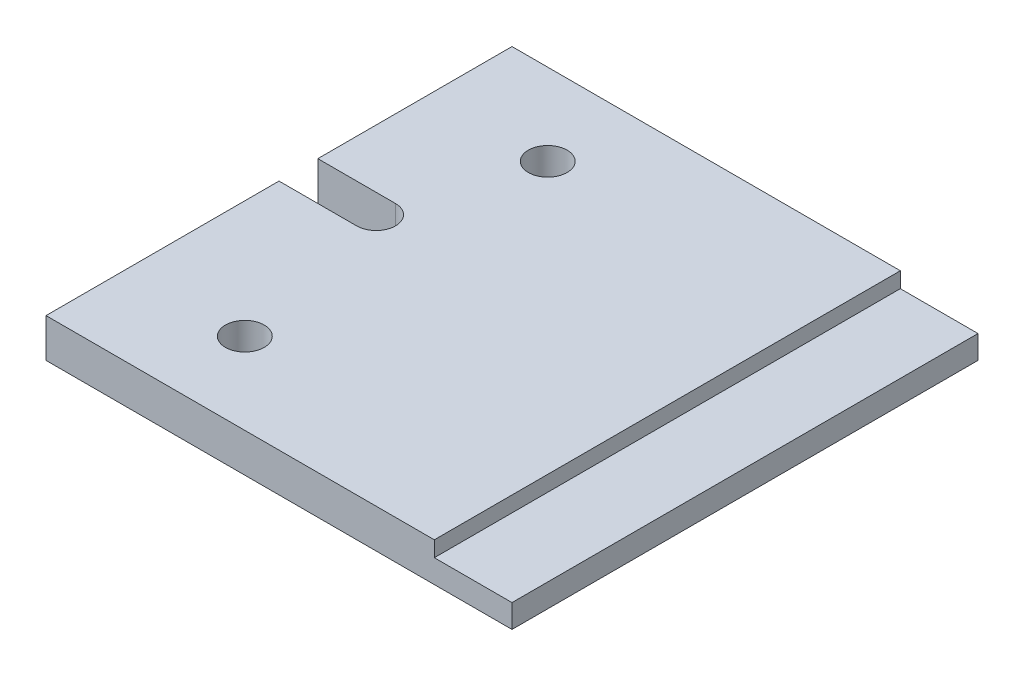
ISO-10303-21;
HEADER;
FILE_DESCRIPTION(('STEP AP214'),'2;1');
FILE_NAME('part.step','',(''),(''),'','','');
FILE_SCHEMA(('AUTOMOTIVE_DESIGN { 1 0 10303 214 1 1 1 1 }'));
ENDSEC;
DATA;
#1=APPLICATION_CONTEXT('core data for automotive mechanical design processes');
#2=APPLICATION_PROTOCOL_DEFINITION('international standard','automotive_design',2000,#1);
#3=PRODUCT_CONTEXT('',#1,'mechanical');
#4=PRODUCT('Part','Part','',(#3));
#5=PRODUCT_RELATED_PRODUCT_CATEGORY('part','',(#4));
#6=PRODUCT_DEFINITION_FORMATION('','',#4);
#7=PRODUCT_DEFINITION_CONTEXT('part definition',#1,'design');
#8=PRODUCT_DEFINITION('design','',#6,#7);
#9=PRODUCT_DEFINITION_SHAPE('','',#8);
#10=(LENGTH_UNIT() NAMED_UNIT(*) SI_UNIT(.MILLI.,.METRE.));
#11=(NAMED_UNIT(*) PLANE_ANGLE_UNIT() SI_UNIT($,.RADIAN.));
#12=(NAMED_UNIT(*) SI_UNIT($,.STERADIAN.) SOLID_ANGLE_UNIT());
#13=UNCERTAINTY_MEASURE_WITH_UNIT(LENGTH_MEASURE(1.E-05),#10,'distance_accuracy_value','');
#14=(GEOMETRIC_REPRESENTATION_CONTEXT(3) GLOBAL_UNCERTAINTY_ASSIGNED_CONTEXT((#13)) GLOBAL_UNIT_ASSIGNED_CONTEXT((#10,
#11,#12)) REPRESENTATION_CONTEXT('',''));
#15=CARTESIAN_POINT('',(0.,0.,0.));
#16=DIRECTION('',(0.,0.,1.));
#17=DIRECTION('',(1.,0.,0.));
#18=AXIS2_PLACEMENT_3D('',#15,#16,#17);
#19=CARTESIAN_POINT('',(0.,6.35,0.));
#20=DIRECTION('',(-1.,0.,0.));
#21=DIRECTION('',(0.,0.,1.));
#22=AXIS2_PLACEMENT_3D('',#19,#20,#21);
#23=PLANE('',#22);
#24=DIRECTION('',(0.,1.,0.));
#25=VECTOR('',#24,1.);
#26=CARTESIAN_POINT('',(0.,0.,-44.45));
#27=LINE('',#26,#25);
#28=CARTESIAN_POINT('',(0.,0.,-44.45));
#29=VERTEX_POINT('',#28);
#30=CARTESIAN_POINT('',(0.,6.35,-44.45));
#31=VERTEX_POINT('',#30);
#32=EDGE_CURVE('E204',#29,#31,#27,.T.);
#33=ORIENTED_EDGE('',*,*,#32,.T.);
#34=DIRECTION('',(0.,0.,-1.));
#35=VECTOR('',#34,1.);
#36=CARTESIAN_POINT('',(0.,6.35,0.));
#37=LINE('',#36,#35);
#38=CARTESIAN_POINT('',(0.,6.35,-76.2));
#39=VERTEX_POINT('',#38);
#40=EDGE_CURVE('E168',#31,#39,#37,.T.);
#41=ORIENTED_EDGE('',*,*,#40,.T.);
#42=DIRECTION('',(0.,-1.,0.));
#43=VECTOR('',#42,1.);
#44=CARTESIAN_POINT('',(0.,6.35,-76.2));
#45=LINE('',#44,#43);
#46=CARTESIAN_POINT('',(0.,0.,-76.2));
#47=VERTEX_POINT('',#46);
#48=EDGE_CURVE('E169',#39,#47,#45,.T.);
#49=ORIENTED_EDGE('',*,*,#48,.T.);
#50=DIRECTION('',(0.,0.,-1.));
#51=VECTOR('',#50,1.);
#52=CARTESIAN_POINT('',(0.,0.,0.));
#53=LINE('',#52,#51);
#54=EDGE_CURVE('E151',#29,#47,#53,.T.);
#55=ORIENTED_EDGE('',*,*,#54,.F.);
#56=EDGE_LOOP('',(#33,#41,#49,#55));
#57=FACE_BOUND('',#56,.T.);
#58=ADVANCED_FACE('F50',(#57),#23,.T.);
#59=CARTESIAN_POINT('',(76.2,6.35,0.));
#60=DIRECTION('',(-1.,0.,0.));
#61=DIRECTION('',(0.,0.,1.));
#62=AXIS2_PLACEMENT_3D('',#59,#60,#61);
#63=PLANE('',#62);
#64=DIRECTION('',(0.,0.,-1.));
#65=VECTOR('',#64,1.);
#66=CARTESIAN_POINT('',(76.2,3.81,0.));
#67=LINE('',#66,#65);
#68=CARTESIAN_POINT('',(76.2,3.81,0.));
#69=VERTEX_POINT('',#68);
#70=CARTESIAN_POINT('',(76.2,3.81,-76.2));
#71=VERTEX_POINT('',#70);
#72=EDGE_CURVE('E178',#69,#71,#67,.T.);
#73=ORIENTED_EDGE('',*,*,#72,.F.);
#74=DIRECTION('',(0.,-1.,0.));
#75=VECTOR('',#74,1.);
#76=CARTESIAN_POINT('',(76.2,6.35,0.));
#77=LINE('',#76,#75);
#78=CARTESIAN_POINT('',(76.2,0.,0.));
#79=VERTEX_POINT('',#78);
#80=EDGE_CURVE('E58',#69,#79,#77,.T.);
#81=ORIENTED_EDGE('',*,*,#80,.T.);
#82=DIRECTION('',(0.,0.,-1.));
#83=VECTOR('',#82,1.);
#84=CARTESIAN_POINT('',(76.2,0.,0.));
#85=LINE('',#84,#83);
#86=CARTESIAN_POINT('',(76.2,0.,-76.2));
#87=VERTEX_POINT('',#86);
#88=EDGE_CURVE('E153',#79,#87,#85,.T.);
#89=ORIENTED_EDGE('',*,*,#88,.T.);
#90=DIRECTION('',(0.,-1.,0.));
#91=VECTOR('',#90,1.);
#92=CARTESIAN_POINT('',(76.2,6.35,-76.2));
#93=LINE('',#92,#91);
#94=EDGE_CURVE('E172',#71,#87,#93,.T.);
#95=ORIENTED_EDGE('',*,*,#94,.F.);
#96=EDGE_LOOP('',(#73,#81,#89,#95));
#97=FACE_BOUND('',#96,.T.);
#98=ADVANCED_FACE('F176',(#97),#63,.F.);
#99=DIRECTION('',(0.,1.,0.));
#100=VECTOR('',#99,1.);
#101=CARTESIAN_POINT('',(0.,0.,-38.1));
#102=LINE('',#101,#100);
#103=CARTESIAN_POINT('',(0.,0.,-38.1));
#104=VERTEX_POINT('',#103);
#105=CARTESIAN_POINT('',(0.,6.35,-38.1));
#106=VERTEX_POINT('',#105);
#107=EDGE_CURVE('E130',#104,#106,#102,.T.);
#108=ORIENTED_EDGE('',*,*,#107,.F.);
#109=CARTESIAN_POINT('',(0.,0.,0.));
#110=VERTEX_POINT('',#109);
#111=EDGE_CURVE('E140',#110,#104,#53,.T.);
#112=ORIENTED_EDGE('',*,*,#111,.F.);
#113=DIRECTION('',(0.,-1.,0.));
#114=VECTOR('',#113,1.);
#115=CARTESIAN_POINT('',(0.,6.35,0.));
#116=LINE('',#115,#114);
#117=CARTESIAN_POINT('',(0.,6.35,0.));
#118=VERTEX_POINT('',#117);
#119=EDGE_CURVE('E12',#118,#110,#116,.T.);
#120=ORIENTED_EDGE('',*,*,#119,.F.);
#121=EDGE_CURVE('E142',#118,#106,#37,.T.);
#122=ORIENTED_EDGE('',*,*,#121,.T.);
#123=EDGE_LOOP('',(#108,#112,#120,#122));
#124=FACE_BOUND('',#123,.T.);
#125=ADVANCED_FACE('F52',(#124),#23,.T.);
#126=CARTESIAN_POINT('',(0.,6.35,0.));
#127=DIRECTION('',(0.,0.,-1.));
#128=DIRECTION('',(-1.,0.,0.));
#129=AXIS2_PLACEMENT_3D('',#126,#127,#128);
#130=PLANE('',#129);
#131=DIRECTION('',(1.,0.,0.));
#132=VECTOR('',#131,1.);
#133=CARTESIAN_POINT('',(63.5,3.81,0.));
#134=LINE('',#133,#132);
#135=CARTESIAN_POINT('',(63.5,3.81,0.));
#136=VERTEX_POINT('',#135);
#137=EDGE_CURVE('E198',#136,#69,#134,.T.);
#138=ORIENTED_EDGE('',*,*,#137,.F.);
#139=DIRECTION('',(0.,1.,0.));
#140=VECTOR('',#139,1.);
#141=CARTESIAN_POINT('',(63.5,3.81,0.));
#142=LINE('',#141,#140);
#143=CARTESIAN_POINT('',(63.5,6.35,0.));
#144=VERTEX_POINT('',#143);
#145=EDGE_CURVE('E205',#136,#144,#142,.T.);
#146=ORIENTED_EDGE('',*,*,#145,.T.);
#147=DIRECTION('',(1.,0.,0.));
#148=VECTOR('',#147,1.);
#149=CARTESIAN_POINT('',(0.,6.35,0.));
#150=LINE('',#149,#148);
#151=EDGE_CURVE('E215',#118,#144,#150,.T.);
#152=ORIENTED_EDGE('',*,*,#151,.F.);
#153=ORIENTED_EDGE('',*,*,#119,.T.);
#154=DIRECTION('',(1.,0.,0.));
#155=VECTOR('',#154,1.);
#156=CARTESIAN_POINT('',(0.,0.,0.));
#157=LINE('',#156,#155);
#158=EDGE_CURVE('E150',#110,#79,#157,.T.);
#159=ORIENTED_EDGE('',*,*,#158,.T.);
#160=ORIENTED_EDGE('',*,*,#80,.F.);
#161=EDGE_LOOP('',(#138,#146,#152,#153,#159,#160));
#162=FACE_BOUND('',#161,.T.);
#163=ADVANCED_FACE('F181',(#162),#130,.F.);
#164=CARTESIAN_POINT('',(0.,6.35,-76.2));
#165=DIRECTION('',(0.,0.,-1.));
#166=DIRECTION('',(-1.,0.,0.));
#167=AXIS2_PLACEMENT_3D('',#164,#165,#166);
#168=PLANE('',#167);
#169=DIRECTION('',(0.,1.,0.));
#170=VECTOR('',#169,1.);
#171=CARTESIAN_POINT('',(63.5,3.81,-76.2));
#172=LINE('',#171,#170);
#173=CARTESIAN_POINT('',(63.5,3.81,-76.2));
#174=VERTEX_POINT('',#173);
#175=CARTESIAN_POINT('',(63.5,6.35,-76.2));
#176=VERTEX_POINT('',#175);
#177=EDGE_CURVE('E73',#174,#176,#172,.T.);
#178=ORIENTED_EDGE('',*,*,#177,.F.);
#179=DIRECTION('',(-1.,0.,0.));
#180=VECTOR('',#179,1.);
#181=CARTESIAN_POINT('',(63.5,3.81,-76.2));
#182=LINE('',#181,#180);
#183=EDGE_CURVE('E192',#71,#174,#182,.T.);
#184=ORIENTED_EDGE('',*,*,#183,.F.);
#185=ORIENTED_EDGE('',*,*,#94,.T.);
#186=DIRECTION('',(1.,0.,0.));
#187=VECTOR('',#186,1.);
#188=CARTESIAN_POINT('',(0.,0.,-76.2));
#189=LINE('',#188,#187);
#190=EDGE_CURVE('E162',#47,#87,#189,.T.);
#191=ORIENTED_EDGE('',*,*,#190,.F.);
#192=ORIENTED_EDGE('',*,*,#48,.F.);
#193=DIRECTION('',(1.,0.,0.));
#194=VECTOR('',#193,1.);
#195=CARTESIAN_POINT('',(0.,6.35,-76.2));
#196=LINE('',#195,#194);
#197=EDGE_CURVE('E217',#39,#176,#196,.T.);
#198=ORIENTED_EDGE('',*,*,#197,.T.);
#199=EDGE_LOOP('',(#178,#184,#185,#191,#192,#198));
#200=FACE_BOUND('',#199,.T.);
#201=ADVANCED_FACE('F188',(#200),#168,.T.);
#202=CARTESIAN_POINT('',(19.177,6.35,-13.335));
#203=DIRECTION('',(0.,-1.,0.));
#204=DIRECTION('',(0.,0.,-1.));
#205=AXIS2_PLACEMENT_3D('',#202,#203,#204);
#206=CYLINDRICAL_SURFACE('',#205,3.175);
#207=CARTESIAN_POINT('',(19.177,6.35,-13.335));
#208=DIRECTION('',(0.,1.,0.));
#209=DIRECTION('',(0.,0.,1.));
#210=AXIS2_PLACEMENT_3D('',#207,#208,#209);
#211=CIRCLE('',#210,3.175);
#212=CARTESIAN_POINT('',(19.177,6.35,-10.16));
#213=VERTEX_POINT('',#212);
#214=EDGE_CURVE('E157',#213,#213,#211,.T.);
#215=ORIENTED_EDGE('',*,*,#214,.T.);
#216=EDGE_LOOP('',(#215));
#217=FACE_BOUND('',#216,.T.);
#218=CARTESIAN_POINT('',(19.177,0.,-13.335));
#219=DIRECTION('',(0.,1.,0.));
#220=DIRECTION('',(0.,0.,1.));
#221=AXIS2_PLACEMENT_3D('',#218,#219,#220);
#222=CIRCLE('',#221,3.175);
#223=CARTESIAN_POINT('',(19.177,0.,-10.16));
#224=VERTEX_POINT('',#223);
#225=EDGE_CURVE('E165',#224,#224,#222,.T.);
#226=ORIENTED_EDGE('',*,*,#225,.F.);
#227=EDGE_LOOP('',(#226));
#228=FACE_BOUND('',#227,.T.);
#229=ADVANCED_FACE('F221',(#217,#228),#206,.F.);
#230=CARTESIAN_POINT('',(0.,6.35,0.));
#231=DIRECTION('',(0.,1.,0.));
#232=DIRECTION('',(0.,0.,1.));
#233=AXIS2_PLACEMENT_3D('',#230,#231,#232);
#234=PLANE('',#233);
#235=DIRECTION('',(-1.,0.,0.));
#236=VECTOR('',#235,1.);
#237=CARTESIAN_POINT('',(0.,6.35,-44.45));
#238=LINE('',#237,#236);
#239=CARTESIAN_POINT('',(12.7,6.35,-44.45));
#240=VERTEX_POINT('',#239);
#241=EDGE_CURVE('E135',#240,#31,#238,.T.);
#242=ORIENTED_EDGE('',*,*,#241,.F.);
#243=CARTESIAN_POINT('',(12.7,6.35,-41.275));
#244=DIRECTION('',(0.,1.,0.));
#245=DIRECTION('',(0.,0.,-1.));
#246=AXIS2_PLACEMENT_3D('',#243,#244,#245);
#247=CIRCLE('',#246,3.175);
#248=CARTESIAN_POINT('',(12.7,6.35,-38.1));
#249=VERTEX_POINT('',#248);
#250=EDGE_CURVE('E351',#249,#240,#247,.T.);
#251=ORIENTED_EDGE('',*,*,#250,.F.);
#252=DIRECTION('',(1.,0.,0.));
#253=VECTOR('',#252,1.);
#254=CARTESIAN_POINT('',(0.,6.35,-38.1));
#255=LINE('',#254,#253);
#256=EDGE_CURVE('E349',#106,#249,#255,.T.);
#257=ORIENTED_EDGE('',*,*,#256,.F.);
#258=ORIENTED_EDGE('',*,*,#121,.F.);
#259=ORIENTED_EDGE('',*,*,#151,.T.);
#260=DIRECTION('',(0.,0.,1.));
#261=VECTOR('',#260,1.);
#262=CARTESIAN_POINT('',(63.5,6.35,0.));
#263=LINE('',#262,#261);
#264=EDGE_CURVE('E202',#176,#144,#263,.T.);
#265=ORIENTED_EDGE('',*,*,#264,.F.);
#266=ORIENTED_EDGE('',*,*,#197,.F.);
#267=ORIENTED_EDGE('',*,*,#40,.F.);
#268=EDGE_LOOP('',(#242,#251,#257,#258,#259,#265,#266,#267));
#269=FACE_BOUND('',#268,.T.);
#270=CARTESIAN_POINT('',(19.177,6.35,-62.865));
#271=DIRECTION('',(0.,-1.,0.));
#272=DIRECTION('',(0.,0.,-1.));
#273=AXIS2_PLACEMENT_3D('',#270,#271,#272);
#274=CIRCLE('',#273,3.175);
#275=CARTESIAN_POINT('',(19.177,6.35,-66.04));
#276=VERTEX_POINT('',#275);
#277=EDGE_CURVE('E155',#276,#276,#274,.T.);
#278=ORIENTED_EDGE('',*,*,#277,.T.);
#279=EDGE_LOOP('',(#278));
#280=FACE_BOUND('',#279,.T.);
#281=ORIENTED_EDGE('',*,*,#214,.F.);
#282=EDGE_LOOP('',(#281));
#283=FACE_BOUND('',#282,.T.);
#284=ADVANCED_FACE('F224',(#269,#280,#283),#234,.T.);
#285=CARTESIAN_POINT('',(0.,0.,0.));
#286=DIRECTION('',(0.,1.,0.));
#287=DIRECTION('',(0.,0.,1.));
#288=AXIS2_PLACEMENT_3D('',#285,#286,#287);
#289=PLANE('',#288);
#290=CARTESIAN_POINT('',(19.177,0.,-62.865));
#291=DIRECTION('',(0.,-1.,0.));
#292=DIRECTION('',(0.,0.,-1.));
#293=AXIS2_PLACEMENT_3D('',#290,#291,#292);
#294=CIRCLE('',#293,3.175);
#295=CARTESIAN_POINT('',(19.177,0.,-66.04));
#296=VERTEX_POINT('',#295);
#297=EDGE_CURVE('E208',#296,#296,#294,.T.);
#298=ORIENTED_EDGE('',*,*,#297,.F.);
#299=EDGE_LOOP('',(#298));
#300=FACE_BOUND('',#299,.T.);
#301=CARTESIAN_POINT('',(12.7,0.,-41.275));
#302=DIRECTION('',(0.,1.,0.));
#303=DIRECTION('',(0.,0.,-1.));
#304=AXIS2_PLACEMENT_3D('',#301,#302,#303);
#305=CIRCLE('',#304,3.175);
#306=CARTESIAN_POINT('',(12.7,0.,-38.1));
#307=VERTEX_POINT('',#306);
#308=CARTESIAN_POINT('',(12.7,0.,-44.45));
#309=VERTEX_POINT('',#308);
#310=EDGE_CURVE('E65',#307,#309,#305,.T.);
#311=ORIENTED_EDGE('',*,*,#310,.T.);
#312=DIRECTION('',(-1.,0.,0.));
#313=VECTOR('',#312,1.);
#314=CARTESIAN_POINT('',(0.,0.,-44.45));
#315=LINE('',#314,#313);
#316=EDGE_CURVE('E143',#309,#29,#315,.T.);
#317=ORIENTED_EDGE('',*,*,#316,.T.);
#318=ORIENTED_EDGE('',*,*,#54,.T.);
#319=ORIENTED_EDGE('',*,*,#190,.T.);
#320=ORIENTED_EDGE('',*,*,#88,.F.);
#321=ORIENTED_EDGE('',*,*,#158,.F.);
#322=ORIENTED_EDGE('',*,*,#111,.T.);
#323=DIRECTION('',(1.,0.,0.));
#324=VECTOR('',#323,1.);
#325=CARTESIAN_POINT('',(0.,0.,-38.1));
#326=LINE('',#325,#324);
#327=EDGE_CURVE('E126',#104,#307,#326,.T.);
#328=ORIENTED_EDGE('',*,*,#327,.T.);
#329=EDGE_LOOP('',(#311,#317,#318,#319,#320,#321,#322,#328));
#330=FACE_BOUND('',#329,.T.);
#331=ORIENTED_EDGE('',*,*,#225,.T.);
#332=EDGE_LOOP('',(#331));
#333=FACE_BOUND('',#332,.T.);
#334=ADVANCED_FACE('F146',(#300,#330,#333),#289,.F.);
#335=CARTESIAN_POINT('',(19.177,6.35,-62.865));
#336=DIRECTION('',(0.,-1.,0.));
#337=DIRECTION('',(0.,0.,-1.));
#338=AXIS2_PLACEMENT_3D('',#335,#336,#337);
#339=CYLINDRICAL_SURFACE('',#338,3.175);
#340=ORIENTED_EDGE('',*,*,#277,.F.);
#341=EDGE_LOOP('',(#340));
#342=FACE_BOUND('',#341,.T.);
#343=ORIENTED_EDGE('',*,*,#297,.T.);
#344=EDGE_LOOP('',(#343));
#345=FACE_BOUND('',#344,.T.);
#346=ADVANCED_FACE('F232',(#342,#345),#339,.F.);
#347=CARTESIAN_POINT('',(63.5,3.81,0.));
#348=DIRECTION('',(-1.,0.,0.));
#349=DIRECTION('',(0.,0.,1.));
#350=AXIS2_PLACEMENT_3D('',#347,#348,#349);
#351=PLANE('',#350);
#352=ORIENTED_EDGE('',*,*,#264,.T.);
#353=ORIENTED_EDGE('',*,*,#145,.F.);
#354=DIRECTION('',(0.,0.,1.));
#355=VECTOR('',#354,1.);
#356=CARTESIAN_POINT('',(63.5,3.81,0.));
#357=LINE('',#356,#355);
#358=EDGE_CURVE('E195',#174,#136,#357,.T.);
#359=ORIENTED_EDGE('',*,*,#358,.F.);
#360=ORIENTED_EDGE('',*,*,#177,.T.);
#361=EDGE_LOOP('',(#352,#353,#359,#360));
#362=FACE_BOUND('',#361,.T.);
#363=ADVANCED_FACE('F271',(#362),#351,.F.);
#364=CARTESIAN_POINT('',(0.,3.81,0.));
#365=DIRECTION('',(0.,1.,0.));
#366=DIRECTION('',(0.,0.,1.));
#367=AXIS2_PLACEMENT_3D('',#364,#365,#366);
#368=PLANE('',#367);
#369=ORIENTED_EDGE('',*,*,#137,.T.);
#370=ORIENTED_EDGE('',*,*,#72,.T.);
#371=ORIENTED_EDGE('',*,*,#183,.T.);
#372=ORIENTED_EDGE('',*,*,#358,.T.);
#373=EDGE_LOOP('',(#369,#370,#371,#372));
#374=FACE_BOUND('',#373,.T.);
#375=ADVANCED_FACE('F323',(#374),#368,.T.);
#376=CARTESIAN_POINT('',(0.,0.,-44.45));
#377=DIRECTION('',(0.,0.,-1.));
#378=DIRECTION('',(-1.,0.,0.));
#379=AXIS2_PLACEMENT_3D('',#376,#377,#378);
#380=PLANE('',#379);
#381=ORIENTED_EDGE('',*,*,#241,.T.);
#382=ORIENTED_EDGE('',*,*,#32,.F.);
#383=ORIENTED_EDGE('',*,*,#316,.F.);
#384=DIRECTION('',(0.,1.,0.));
#385=VECTOR('',#384,1.);
#386=CARTESIAN_POINT('',(12.7,0.,-44.45));
#387=LINE('',#386,#385);
#388=EDGE_CURVE('E359',#309,#240,#387,.T.);
#389=ORIENTED_EDGE('',*,*,#388,.T.);
#390=EDGE_LOOP('',(#381,#382,#383,#389));
#391=FACE_BOUND('',#390,.T.);
#392=ADVANCED_FACE('F317',(#391),#380,.F.);
#393=CARTESIAN_POINT('',(12.7,0.,-41.275));
#394=DIRECTION('',(0.,1.,0.));
#395=DIRECTION('',(0.,0.,1.));
#396=AXIS2_PLACEMENT_3D('',#393,#394,#395);
#397=CYLINDRICAL_SURFACE('',#396,3.175);
#398=ORIENTED_EDGE('',*,*,#250,.T.);
#399=ORIENTED_EDGE('',*,*,#388,.F.);
#400=ORIENTED_EDGE('',*,*,#310,.F.);
#401=DIRECTION('',(0.,1.,0.));
#402=VECTOR('',#401,1.);
#403=CARTESIAN_POINT('',(12.7,0.,-38.1));
#404=LINE('',#403,#402);
#405=EDGE_CURVE('E132',#307,#249,#404,.T.);
#406=ORIENTED_EDGE('',*,*,#405,.T.);
#407=EDGE_LOOP('',(#398,#399,#400,#406));
#408=FACE_BOUND('',#407,.T.);
#409=ADVANCED_FACE('F322',(#408),#397,.F.);
#410=CARTESIAN_POINT('',(0.,0.,-38.1));
#411=DIRECTION('',(0.,0.,1.));
#412=DIRECTION('',(1.,0.,0.));
#413=AXIS2_PLACEMENT_3D('',#410,#411,#412);
#414=PLANE('',#413);
#415=ORIENTED_EDGE('',*,*,#256,.T.);
#416=ORIENTED_EDGE('',*,*,#405,.F.);
#417=ORIENTED_EDGE('',*,*,#327,.F.);
#418=ORIENTED_EDGE('',*,*,#107,.T.);
#419=EDGE_LOOP('',(#415,#416,#417,#418));
#420=FACE_BOUND('',#419,.T.);
#421=ADVANCED_FACE('F129',(#420),#414,.F.);
#422=CLOSED_SHELL('',(#58,#98,#125,#163,#201,#229,#284,#334,#346,#363,#375,#392,#409,#421));
#423=MANIFOLD_SOLID_BREP('B2',#422);
#424=ADVANCED_BREP_SHAPE_REPRESENTATION('',(#18,#423),#14);
#425=SHAPE_DEFINITION_REPRESENTATION(#9,#424);
ENDSEC;
END-ISO-10303-21;
